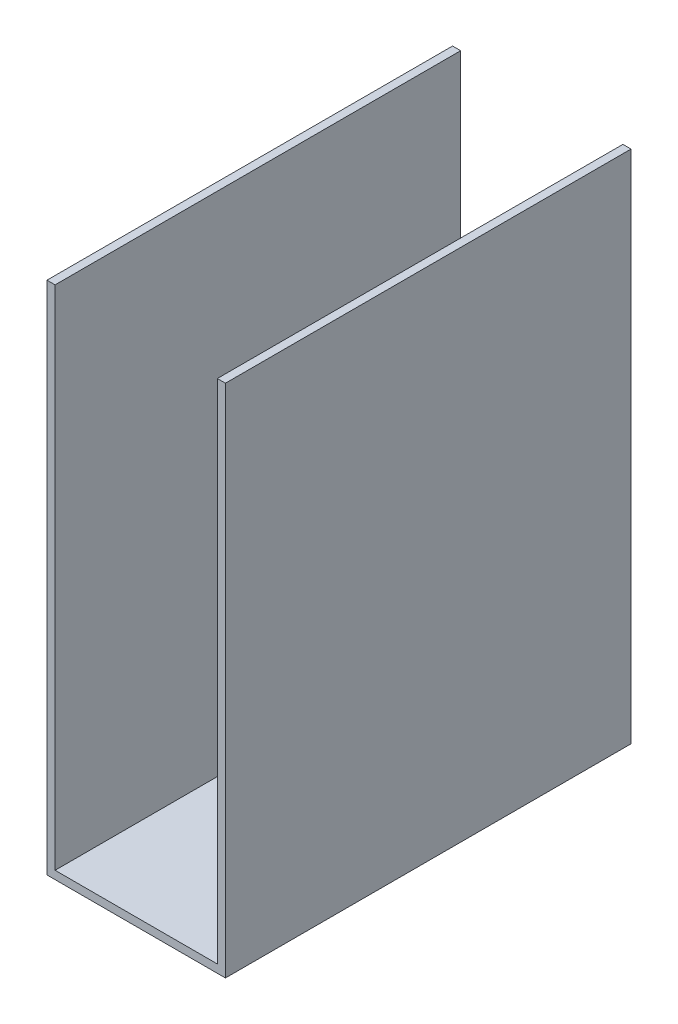
ISO-10303-21;
HEADER;
FILE_DESCRIPTION(('STEP AP214'),'2;1');
FILE_NAME('part.step','',(''),(''),'','','');
FILE_SCHEMA(('AUTOMOTIVE_DESIGN { 1 0 10303 214 1 1 1 1 }'));
ENDSEC;
DATA;
#1=APPLICATION_CONTEXT('core data for automotive mechanical design processes');
#2=APPLICATION_PROTOCOL_DEFINITION('international standard','automotive_design',2000,#1);
#3=PRODUCT_CONTEXT('',#1,'mechanical');
#4=PRODUCT('Part','Part','',(#3));
#5=PRODUCT_RELATED_PRODUCT_CATEGORY('part','',(#4));
#6=PRODUCT_DEFINITION_FORMATION('','',#4);
#7=PRODUCT_DEFINITION_CONTEXT('part definition',#1,'design');
#8=PRODUCT_DEFINITION('design','',#6,#7);
#9=PRODUCT_DEFINITION_SHAPE('','',#8);
#10=(LENGTH_UNIT() NAMED_UNIT(*) SI_UNIT(.MILLI.,.METRE.));
#11=(NAMED_UNIT(*) PLANE_ANGLE_UNIT() SI_UNIT($,.RADIAN.));
#12=(NAMED_UNIT(*) SI_UNIT($,.STERADIAN.) SOLID_ANGLE_UNIT());
#13=UNCERTAINTY_MEASURE_WITH_UNIT(LENGTH_MEASURE(1.E-05),#10,'distance_accuracy_value','');
#14=(GEOMETRIC_REPRESENTATION_CONTEXT(3) GLOBAL_UNCERTAINTY_ASSIGNED_CONTEXT((#13)) GLOBAL_UNIT_ASSIGNED_CONTEXT((#10,
#11,#12)) REPRESENTATION_CONTEXT('',''));
#15=CARTESIAN_POINT('',(0.,0.,0.));
#16=DIRECTION('',(0.,0.,1.));
#17=DIRECTION('',(1.,0.,0.));
#18=AXIS2_PLACEMENT_3D('',#15,#16,#17);
#19=CARTESIAN_POINT('',(-200.,0.,-10000.));
#20=DIRECTION('',(0.,1.,0.));
#21=DIRECTION('',(0.,0.,1.));
#22=AXIS2_PLACEMENT_3D('',#19,#20,#21);
#23=PLANE('',#22);
#24=DIRECTION('',(-1.,0.,0.));
#25=VECTOR('',#24,1.);
#26=CARTESIAN_POINT('',(-200.,0.,0.));
#27=LINE('',#26,#25);
#28=CARTESIAN_POINT('',(0.,0.,0.));
#29=VERTEX_POINT('',#28);
#30=CARTESIAN_POINT('',(-200.,0.,0.));
#31=VERTEX_POINT('',#30);
#32=EDGE_CURVE('E146',#29,#31,#27,.T.);
#33=ORIENTED_EDGE('',*,*,#32,.F.);
#34=DIRECTION('',(0.,0.,1.));
#35=VECTOR('',#34,1.);
#36=CARTESIAN_POINT('',(0.,0.,-10000.));
#37=LINE('',#36,#35);
#38=CARTESIAN_POINT('',(0.,0.,-10000.));
#39=VERTEX_POINT('',#38);
#40=EDGE_CURVE('E11',#39,#29,#37,.T.);
#41=ORIENTED_EDGE('',*,*,#40,.F.);
#42=DIRECTION('',(-1.,0.,0.));
#43=VECTOR('',#42,1.);
#44=CARTESIAN_POINT('',(-200.,0.,-10000.));
#45=LINE('',#44,#43);
#46=CARTESIAN_POINT('',(-200.,0.,-10000.));
#47=VERTEX_POINT('',#46);
#48=EDGE_CURVE('E174',#39,#47,#45,.T.);
#49=ORIENTED_EDGE('',*,*,#48,.T.);
#50=DIRECTION('',(0.,0.,1.));
#51=VECTOR('',#50,1.);
#52=CARTESIAN_POINT('',(-200.,0.,-10000.));
#53=LINE('',#52,#51);
#54=EDGE_CURVE('E46',#47,#31,#53,.T.);
#55=ORIENTED_EDGE('',*,*,#54,.T.);
#56=EDGE_LOOP('',(#33,#41,#49,#55));
#57=FACE_BOUND('',#56,.T.);
#58=ADVANCED_FACE('F43',(#57),#23,.T.);
#59=CARTESIAN_POINT('',(0.,0.,-10000.));
#60=DIRECTION('',(1.,0.,0.));
#61=DIRECTION('',(0.,1.,0.));
#62=AXIS2_PLACEMENT_3D('',#59,#60,#61);
#63=PLANE('',#62);
#64=DIRECTION('',(0.,1.,0.));
#65=VECTOR('',#64,1.);
#66=CARTESIAN_POINT('',(0.,0.,0.));
#67=LINE('',#66,#65);
#68=CARTESIAN_POINT('',(1.53080849893419E-12,-12500.,0.));
#69=VERTEX_POINT('',#68);
#70=EDGE_CURVE('E171',#69,#29,#67,.T.);
#71=ORIENTED_EDGE('',*,*,#70,.F.);
#72=DIRECTION('',(0.,0.,1.));
#73=VECTOR('',#72,1.);
#74=CARTESIAN_POINT('',(1.53080849893419E-12,-12500.,-10000.));
#75=LINE('',#74,#73);
#76=CARTESIAN_POINT('',(1.53080849893419E-12,-12500.,-10000.));
#77=VERTEX_POINT('',#76);
#78=EDGE_CURVE('E53',#77,#69,#75,.T.);
#79=ORIENTED_EDGE('',*,*,#78,.F.);
#80=DIRECTION('',(0.,1.,0.));
#81=VECTOR('',#80,1.);
#82=CARTESIAN_POINT('',(0.,0.,-10000.));
#83=LINE('',#82,#81);
#84=EDGE_CURVE('E132',#77,#39,#83,.T.);
#85=ORIENTED_EDGE('',*,*,#84,.T.);
#86=ORIENTED_EDGE('',*,*,#40,.T.);
#87=EDGE_LOOP('',(#71,#79,#85,#86));
#88=FACE_BOUND('',#87,.T.);
#89=ADVANCED_FACE('F192',(#88),#63,.T.);
#90=CARTESIAN_POINT('',(1.53080849893419E-12,-12500.,-10000.));
#91=DIRECTION('',(0.,1.,0.));
#92=DIRECTION('',(0.,0.,1.));
#93=AXIS2_PLACEMENT_3D('',#90,#91,#92);
#94=PLANE('',#93);
#95=DIRECTION('',(-1.,0.,0.));
#96=VECTOR('',#95,1.);
#97=CARTESIAN_POINT('',(1.53080849893419E-12,-12500.,0.));
#98=LINE('',#97,#96);
#99=CARTESIAN_POINT('',(4000.,-12500.,0.));
#100=VERTEX_POINT('',#99);
#101=EDGE_CURVE('E118',#100,#69,#98,.T.);
#102=ORIENTED_EDGE('',*,*,#101,.F.);
#103=DIRECTION('',(0.,0.,1.));
#104=VECTOR('',#103,1.);
#105=CARTESIAN_POINT('',(4000.,-12500.,-10000.));
#106=LINE('',#105,#104);
#107=CARTESIAN_POINT('',(4000.,-12500.,-10000.));
#108=VERTEX_POINT('',#107);
#109=EDGE_CURVE('E113',#108,#100,#106,.T.);
#110=ORIENTED_EDGE('',*,*,#109,.F.);
#111=DIRECTION('',(-1.,0.,0.));
#112=VECTOR('',#111,1.);
#113=CARTESIAN_POINT('',(1.53080849893419E-12,-12500.,-10000.));
#114=LINE('',#113,#112);
#115=EDGE_CURVE('E116',#108,#77,#114,.T.);
#116=ORIENTED_EDGE('',*,*,#115,.T.);
#117=ORIENTED_EDGE('',*,*,#78,.T.);
#118=EDGE_LOOP('',(#102,#110,#116,#117));
#119=FACE_BOUND('',#118,.T.);
#120=ADVANCED_FACE('F115',(#119),#94,.T.);
#121=CARTESIAN_POINT('',(4000.,-12500.,-10000.));
#122=DIRECTION('',(-1.,0.,0.));
#123=DIRECTION('',(0.,0.,1.));
#124=AXIS2_PLACEMENT_3D('',#121,#122,#123);
#125=PLANE('',#124);
#126=DIRECTION('',(0.,-1.,0.));
#127=VECTOR('',#126,1.);
#128=CARTESIAN_POINT('',(4000.,-12500.,0.));
#129=LINE('',#128,#127);
#130=CARTESIAN_POINT('',(4000.,0.,0.));
#131=VERTEX_POINT('',#130);
#132=EDGE_CURVE('E166',#131,#100,#129,.T.);
#133=ORIENTED_EDGE('',*,*,#132,.F.);
#134=DIRECTION('',(0.,0.,1.));
#135=VECTOR('',#134,1.);
#136=CARTESIAN_POINT('',(4000.,0.,-10000.));
#137=LINE('',#136,#135);
#138=CARTESIAN_POINT('',(4000.,0.,-10000.));
#139=VERTEX_POINT('',#138);
#140=EDGE_CURVE('E124',#139,#131,#137,.T.);
#141=ORIENTED_EDGE('',*,*,#140,.F.);
#142=DIRECTION('',(0.,-1.,0.));
#143=VECTOR('',#142,1.);
#144=CARTESIAN_POINT('',(4000.,-12500.,-10000.));
#145=LINE('',#144,#143);
#146=EDGE_CURVE('E130',#139,#108,#145,.T.);
#147=ORIENTED_EDGE('',*,*,#146,.T.);
#148=ORIENTED_EDGE('',*,*,#109,.T.);
#149=EDGE_LOOP('',(#133,#141,#147,#148));
#150=FACE_BOUND('',#149,.T.);
#151=ADVANCED_FACE('F135',(#150),#125,.T.);
#152=CARTESIAN_POINT('',(4000.,0.,-10000.));
#153=DIRECTION('',(0.,1.,0.));
#154=DIRECTION('',(0.,0.,1.));
#155=AXIS2_PLACEMENT_3D('',#152,#153,#154);
#156=PLANE('',#155);
#157=DIRECTION('',(-1.,0.,0.));
#158=VECTOR('',#157,1.);
#159=CARTESIAN_POINT('',(4000.,0.,0.));
#160=LINE('',#159,#158);
#161=CARTESIAN_POINT('',(4200.,0.,0.));
#162=VERTEX_POINT('',#161);
#163=EDGE_CURVE('E162',#162,#131,#160,.T.);
#164=ORIENTED_EDGE('',*,*,#163,.F.);
#165=DIRECTION('',(0.,0.,1.));
#166=VECTOR('',#165,1.);
#167=CARTESIAN_POINT('',(4200.,0.,-10000.));
#168=LINE('',#167,#166);
#169=CARTESIAN_POINT('',(4200.,0.,-10000.));
#170=VERTEX_POINT('',#169);
#171=EDGE_CURVE('E180',#170,#162,#168,.T.);
#172=ORIENTED_EDGE('',*,*,#171,.F.);
#173=DIRECTION('',(-1.,0.,0.));
#174=VECTOR('',#173,1.);
#175=CARTESIAN_POINT('',(4000.,0.,-10000.));
#176=LINE('',#175,#174);
#177=EDGE_CURVE('E137',#170,#139,#176,.T.);
#178=ORIENTED_EDGE('',*,*,#177,.T.);
#179=ORIENTED_EDGE('',*,*,#140,.T.);
#180=EDGE_LOOP('',(#164,#172,#178,#179));
#181=FACE_BOUND('',#180,.T.);
#182=ADVANCED_FACE('F205',(#181),#156,.T.);
#183=CARTESIAN_POINT('',(4200.,-12700.,-10000.));
#184=DIRECTION('',(1.,0.,0.));
#185=DIRECTION('',(0.,0.,-1.));
#186=AXIS2_PLACEMENT_3D('',#183,#184,#185);
#187=PLANE('',#186);
#188=DIRECTION('',(0.,1.,0.));
#189=VECTOR('',#188,1.);
#190=CARTESIAN_POINT('',(4200.,-12700.,0.));
#191=LINE('',#190,#189);
#192=CARTESIAN_POINT('',(4200.,-12700.,0.));
#193=VERTEX_POINT('',#192);
#194=EDGE_CURVE('E158',#193,#162,#191,.T.);
#195=ORIENTED_EDGE('',*,*,#194,.F.);
#196=DIRECTION('',(0.,0.,1.));
#197=VECTOR('',#196,1.);
#198=CARTESIAN_POINT('',(4200.,-12700.,-10000.));
#199=LINE('',#198,#197);
#200=CARTESIAN_POINT('',(4200.,-12700.,-10000.));
#201=VERTEX_POINT('',#200);
#202=EDGE_CURVE('E183',#201,#193,#199,.T.);
#203=ORIENTED_EDGE('',*,*,#202,.F.);
#204=DIRECTION('',(0.,1.,0.));
#205=VECTOR('',#204,1.);
#206=CARTESIAN_POINT('',(4200.,-12700.,-10000.));
#207=LINE('',#206,#205);
#208=EDGE_CURVE('E140',#201,#170,#207,.T.);
#209=ORIENTED_EDGE('',*,*,#208,.T.);
#210=ORIENTED_EDGE('',*,*,#171,.T.);
#211=EDGE_LOOP('',(#195,#203,#209,#210));
#212=FACE_BOUND('',#211,.T.);
#213=ADVANCED_FACE('F208',(#212),#187,.T.);
#214=CARTESIAN_POINT('',(-199.999999999998,-12700.,-10000.));
#215=DIRECTION('',(0.,-1.,0.));
#216=DIRECTION('',(0.,0.,-1.));
#217=AXIS2_PLACEMENT_3D('',#214,#215,#216);
#218=PLANE('',#217);
#219=DIRECTION('',(1.,0.,0.));
#220=VECTOR('',#219,1.);
#221=CARTESIAN_POINT('',(-199.999999999998,-12700.,0.));
#222=LINE('',#221,#220);
#223=CARTESIAN_POINT('',(-199.999999999998,-12700.,0.));
#224=VERTEX_POINT('',#223);
#225=EDGE_CURVE('E154',#224,#193,#222,.T.);
#226=ORIENTED_EDGE('',*,*,#225,.F.);
#227=DIRECTION('',(0.,0.,1.));
#228=VECTOR('',#227,1.);
#229=CARTESIAN_POINT('',(-199.999999999998,-12700.,-10000.));
#230=LINE('',#229,#228);
#231=CARTESIAN_POINT('',(-199.999999999998,-12700.,-10000.));
#232=VERTEX_POINT('',#231);
#233=EDGE_CURVE('E185',#232,#224,#230,.T.);
#234=ORIENTED_EDGE('',*,*,#233,.F.);
#235=DIRECTION('',(1.,0.,0.));
#236=VECTOR('',#235,1.);
#237=CARTESIAN_POINT('',(-199.999999999998,-12700.,-10000.));
#238=LINE('',#237,#236);
#239=EDGE_CURVE('E303',#232,#201,#238,.T.);
#240=ORIENTED_EDGE('',*,*,#239,.T.);
#241=ORIENTED_EDGE('',*,*,#202,.T.);
#242=EDGE_LOOP('',(#226,#234,#240,#241));
#243=FACE_BOUND('',#242,.T.);
#244=ADVANCED_FACE('F212',(#243),#218,.T.);
#245=CARTESIAN_POINT('',(-200.,0.,-10000.));
#246=DIRECTION('',(-1.,0.,0.));
#247=DIRECTION('',(0.,-1.,0.));
#248=AXIS2_PLACEMENT_3D('',#245,#246,#247);
#249=PLANE('',#248);
#250=DIRECTION('',(0.,-1.,0.));
#251=VECTOR('',#250,1.);
#252=CARTESIAN_POINT('',(-200.,0.,0.));
#253=LINE('',#252,#251);
#254=EDGE_CURVE('E150',#31,#224,#253,.T.);
#255=ORIENTED_EDGE('',*,*,#254,.F.);
#256=ORIENTED_EDGE('',*,*,#54,.F.);
#257=DIRECTION('',(0.,-1.,0.));
#258=VECTOR('',#257,1.);
#259=CARTESIAN_POINT('',(-200.,0.,-10000.));
#260=LINE('',#259,#258);
#261=EDGE_CURVE('E306',#47,#232,#260,.T.);
#262=ORIENTED_EDGE('',*,*,#261,.T.);
#263=ORIENTED_EDGE('',*,*,#233,.T.);
#264=EDGE_LOOP('',(#255,#256,#262,#263));
#265=FACE_BOUND('',#264,.T.);
#266=ADVANCED_FACE('F189',(#265),#249,.T.);
#267=CARTESIAN_POINT('',(0.,0.,-10000.));
#268=DIRECTION('',(0.,0.,-1.));
#269=DIRECTION('',(-1.,0.,0.));
#270=AXIS2_PLACEMENT_3D('',#267,#268,#269);
#271=PLANE('',#270);
#272=ORIENTED_EDGE('',*,*,#48,.F.);
#273=ORIENTED_EDGE('',*,*,#84,.F.);
#274=ORIENTED_EDGE('',*,*,#115,.F.);
#275=ORIENTED_EDGE('',*,*,#146,.F.);
#276=ORIENTED_EDGE('',*,*,#177,.F.);
#277=ORIENTED_EDGE('',*,*,#208,.F.);
#278=ORIENTED_EDGE('',*,*,#239,.F.);
#279=ORIENTED_EDGE('',*,*,#261,.F.);
#280=EDGE_LOOP('',(#272,#273,#274,#275,#276,#277,#278,#279));
#281=FACE_BOUND('',#280,.T.);
#282=ADVANCED_FACE('F128',(#281),#271,.T.);
#283=CARTESIAN_POINT('',(0.,0.,0.));
#284=DIRECTION('',(0.,0.,-1.));
#285=DIRECTION('',(-1.,0.,0.));
#286=AXIS2_PLACEMENT_3D('',#283,#284,#285);
#287=PLANE('',#286);
#288=ORIENTED_EDGE('',*,*,#32,.T.);
#289=ORIENTED_EDGE('',*,*,#254,.T.);
#290=ORIENTED_EDGE('',*,*,#225,.T.);
#291=ORIENTED_EDGE('',*,*,#194,.T.);
#292=ORIENTED_EDGE('',*,*,#163,.T.);
#293=ORIENTED_EDGE('',*,*,#132,.T.);
#294=ORIENTED_EDGE('',*,*,#101,.T.);
#295=ORIENTED_EDGE('',*,*,#70,.T.);
#296=EDGE_LOOP('',(#288,#289,#290,#291,#292,#293,#294,#295));
#297=FACE_BOUND('',#296,.T.);
#298=ADVANCED_FACE('F191',(#297),#287,.F.);
#299=CLOSED_SHELL('',(#58,#89,#120,#151,#182,#213,#244,#266,#282,#298));
#300=MANIFOLD_SOLID_BREP('B2',#299);
#301=ADVANCED_BREP_SHAPE_REPRESENTATION('',(#18,#300),#14);
#302=SHAPE_DEFINITION_REPRESENTATION(#9,#301);
ENDSEC;
END-ISO-10303-21;
